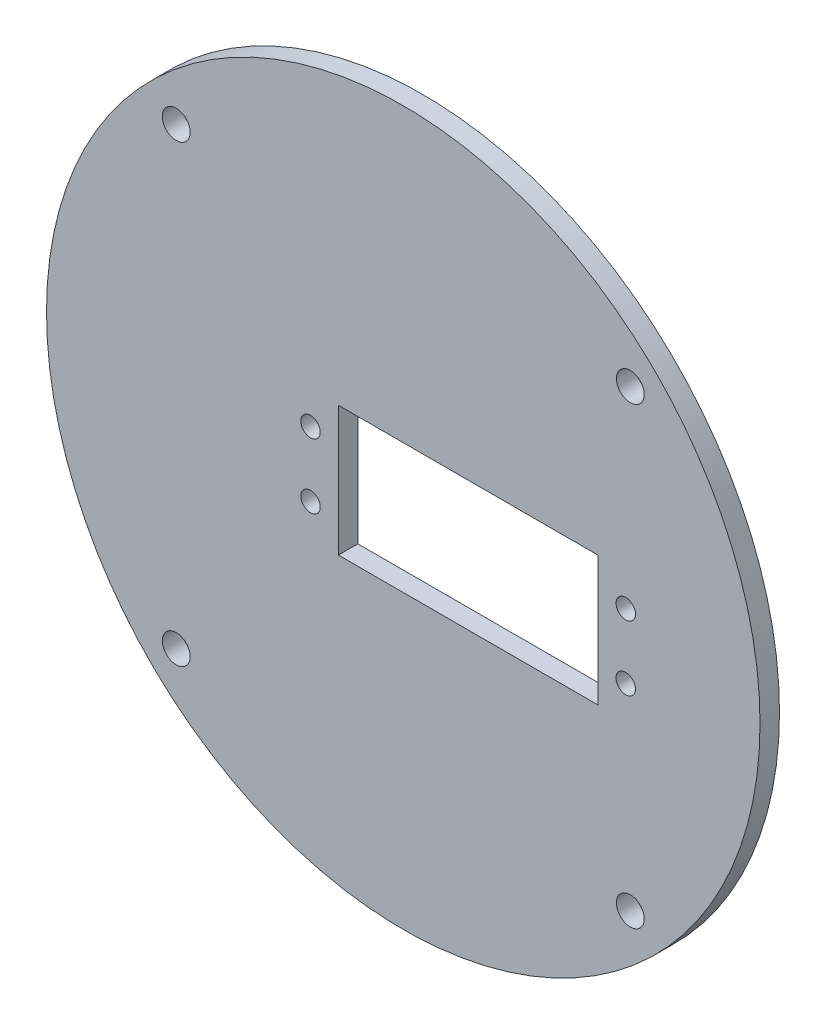
ISO-10303-21;
HEADER;
FILE_DESCRIPTION(('STEP AP214'),'2;1');
FILE_NAME('part.step','',(''),(''),'','','');
FILE_SCHEMA(('AUTOMOTIVE_DESIGN { 1 0 10303 214 1 1 1 1 }'));
ENDSEC;
DATA;
#1=APPLICATION_CONTEXT('core data for automotive mechanical design processes');
#2=APPLICATION_PROTOCOL_DEFINITION('international standard','automotive_design',2000,#1);
#3=PRODUCT_CONTEXT('',#1,'mechanical');
#4=PRODUCT('Part','Part','',(#3));
#5=PRODUCT_RELATED_PRODUCT_CATEGORY('part','',(#4));
#6=PRODUCT_DEFINITION_FORMATION('','',#4);
#7=PRODUCT_DEFINITION_CONTEXT('part definition',#1,'design');
#8=PRODUCT_DEFINITION('design','',#6,#7);
#9=PRODUCT_DEFINITION_SHAPE('','',#8);
#10=(LENGTH_UNIT() NAMED_UNIT(*) SI_UNIT(.MILLI.,.METRE.));
#11=(NAMED_UNIT(*) PLANE_ANGLE_UNIT() SI_UNIT($,.RADIAN.));
#12=(NAMED_UNIT(*) SI_UNIT($,.STERADIAN.) SOLID_ANGLE_UNIT());
#13=UNCERTAINTY_MEASURE_WITH_UNIT(LENGTH_MEASURE(1.E-05),#10,'distance_accuracy_value','');
#14=(GEOMETRIC_REPRESENTATION_CONTEXT(3) GLOBAL_UNCERTAINTY_ASSIGNED_CONTEXT((#13)) GLOBAL_UNIT_ASSIGNED_CONTEXT((#10,
#11,#12)) REPRESENTATION_CONTEXT('',''));
#15=CARTESIAN_POINT('',(0.,0.,0.));
#16=DIRECTION('',(0.,0.,1.));
#17=DIRECTION('',(1.,0.,0.));
#18=AXIS2_PLACEMENT_3D('',#15,#16,#17);
#19=CARTESIAN_POINT('',(0.,-10.,3.));
#20=DIRECTION('',(0.,1.,0.));
#21=DIRECTION('',(0.,0.,1.));
#22=AXIS2_PLACEMENT_3D('',#19,#20,#21);
#23=PLANE('',#22);
#24=DIRECTION('',(1.,0.,0.));
#25=VECTOR('',#24,1.);
#26=CARTESIAN_POINT('',(0.,-10.,0.));
#27=LINE('',#26,#25);
#28=CARTESIAN_POINT('',(-10.,-10.,0.));
#29=VERTEX_POINT('',#28);
#30=CARTESIAN_POINT('',(30.,-10.,0.));
#31=VERTEX_POINT('',#30);
#32=EDGE_CURVE('E157',#29,#31,#27,.T.);
#33=ORIENTED_EDGE('',*,*,#32,.F.);
#34=DIRECTION('',(0.,0.,-1.));
#35=VECTOR('',#34,1.);
#36=CARTESIAN_POINT('',(-10.,-10.,3.));
#37=LINE('',#36,#35);
#38=CARTESIAN_POINT('',(-10.,-10.,3.));
#39=VERTEX_POINT('',#38);
#40=EDGE_CURVE('E11',#39,#29,#37,.T.);
#41=ORIENTED_EDGE('',*,*,#40,.F.);
#42=DIRECTION('',(1.,0.,0.));
#43=VECTOR('',#42,1.);
#44=CARTESIAN_POINT('',(0.,-10.,3.));
#45=LINE('',#44,#43);
#46=CARTESIAN_POINT('',(30.,-10.,3.));
#47=VERTEX_POINT('',#46);
#48=EDGE_CURVE('E115',#39,#47,#45,.T.);
#49=ORIENTED_EDGE('',*,*,#48,.T.);
#50=DIRECTION('',(0.,0.,-1.));
#51=VECTOR('',#50,1.);
#52=CARTESIAN_POINT('',(30.,-10.,3.));
#53=LINE('',#52,#51);
#54=EDGE_CURVE('E88',#47,#31,#53,.T.);
#55=ORIENTED_EDGE('',*,*,#54,.T.);
#56=EDGE_LOOP('',(#33,#41,#49,#55));
#57=FACE_BOUND('',#56,.T.);
#58=ADVANCED_FACE('F50',(#57),#23,.T.);
#59=CARTESIAN_POINT('',(-10.,0.,3.));
#60=DIRECTION('',(1.,0.,0.));
#61=DIRECTION('',(0.,0.,-1.));
#62=AXIS2_PLACEMENT_3D('',#59,#60,#61);
#63=PLANE('',#62);
#64=DIRECTION('',(0.,-1.,0.));
#65=VECTOR('',#64,1.);
#66=CARTESIAN_POINT('',(-10.,0.,0.));
#67=LINE('',#66,#65);
#68=CARTESIAN_POINT('',(-10.,10.,0.));
#69=VERTEX_POINT('',#68);
#70=EDGE_CURVE('E99',#69,#29,#67,.T.);
#71=ORIENTED_EDGE('',*,*,#70,.F.);
#72=DIRECTION('',(0.,0.,-1.));
#73=VECTOR('',#72,1.);
#74=CARTESIAN_POINT('',(-10.,10.,3.));
#75=LINE('',#74,#73);
#76=CARTESIAN_POINT('',(-10.,10.,3.));
#77=VERTEX_POINT('',#76);
#78=EDGE_CURVE('E60',#77,#69,#75,.T.);
#79=ORIENTED_EDGE('',*,*,#78,.F.);
#80=DIRECTION('',(0.,-1.,0.));
#81=VECTOR('',#80,1.);
#82=CARTESIAN_POINT('',(-10.,0.,3.));
#83=LINE('',#82,#81);
#84=EDGE_CURVE('E96',#77,#39,#83,.T.);
#85=ORIENTED_EDGE('',*,*,#84,.T.);
#86=ORIENTED_EDGE('',*,*,#40,.T.);
#87=EDGE_LOOP('',(#71,#79,#85,#86));
#88=FACE_BOUND('',#87,.T.);
#89=ADVANCED_FACE('F98',(#88),#63,.T.);
#90=CARTESIAN_POINT('',(0.,10.,3.));
#91=DIRECTION('',(0.,1.,0.));
#92=DIRECTION('',(0.,0.,1.));
#93=AXIS2_PLACEMENT_3D('',#90,#91,#92);
#94=PLANE('',#93);
#95=DIRECTION('',(1.,0.,0.));
#96=VECTOR('',#95,1.);
#97=CARTESIAN_POINT('',(0.,10.,0.));
#98=LINE('',#97,#96);
#99=CARTESIAN_POINT('',(30.,10.,0.));
#100=VERTEX_POINT('',#99);
#101=EDGE_CURVE('E161',#69,#100,#98,.T.);
#102=ORIENTED_EDGE('',*,*,#101,.T.);
#103=DIRECTION('',(0.,0.,-1.));
#104=VECTOR('',#103,1.);
#105=CARTESIAN_POINT('',(30.,10.,3.));
#106=LINE('',#105,#104);
#107=CARTESIAN_POINT('',(30.,10.,3.));
#108=VERTEX_POINT('',#107);
#109=EDGE_CURVE('E104',#108,#100,#106,.T.);
#110=ORIENTED_EDGE('',*,*,#109,.F.);
#111=DIRECTION('',(1.,0.,0.));
#112=VECTOR('',#111,1.);
#113=CARTESIAN_POINT('',(0.,10.,3.));
#114=LINE('',#113,#112);
#115=EDGE_CURVE('E106',#77,#108,#114,.T.);
#116=ORIENTED_EDGE('',*,*,#115,.F.);
#117=ORIENTED_EDGE('',*,*,#78,.T.);
#118=EDGE_LOOP('',(#102,#110,#116,#117));
#119=FACE_BOUND('',#118,.T.);
#120=ADVANCED_FACE('F110',(#119),#94,.F.);
#121=CARTESIAN_POINT('',(35.0017856687341,-35.0017856687341,3.));
#122=DIRECTION('',(0.,0.,-1.));
#123=DIRECTION('',(-1.,0.,0.));
#124=AXIS2_PLACEMENT_3D('',#121,#122,#123);
#125=CYLINDRICAL_SURFACE('',#124,2.15);
#126=CARTESIAN_POINT('',(35.0017856687341,-35.0017856687341,3.));
#127=DIRECTION('',(0.,0.,1.));
#128=DIRECTION('',(1.,0.,0.));
#129=AXIS2_PLACEMENT_3D('',#126,#127,#128);
#130=CIRCLE('',#129,2.15);
#131=CARTESIAN_POINT('',(37.1517856687341,-35.0017856687341,3.));
#132=VERTEX_POINT('',#131);
#133=EDGE_CURVE('E145',#132,#132,#130,.T.);
#134=ORIENTED_EDGE('',*,*,#133,.T.);
#135=EDGE_LOOP('',(#134));
#136=FACE_BOUND('',#135,.T.);
#137=CARTESIAN_POINT('',(35.0017856687341,-35.0017856687341,0.));
#138=DIRECTION('',(0.,0.,1.));
#139=DIRECTION('',(1.,0.,0.));
#140=AXIS2_PLACEMENT_3D('',#137,#138,#139);
#141=CIRCLE('',#140,2.15);
#142=CARTESIAN_POINT('',(37.1517856687341,-35.0017856687341,0.));
#143=VERTEX_POINT('',#142);
#144=EDGE_CURVE('E189',#143,#143,#141,.T.);
#145=ORIENTED_EDGE('',*,*,#144,.F.);
#146=EDGE_LOOP('',(#145));
#147=FACE_BOUND('',#146,.T.);
#148=ADVANCED_FACE('F237',(#136,#147),#125,.F.);
#149=CARTESIAN_POINT('',(-35.0017856687341,-35.0017856687341,3.));
#150=DIRECTION('',(0.,0.,-1.));
#151=DIRECTION('',(-1.,0.,0.));
#152=AXIS2_PLACEMENT_3D('',#149,#150,#151);
#153=CYLINDRICAL_SURFACE('',#152,2.15);
#154=CARTESIAN_POINT('',(-35.0017856687341,-35.0017856687341,3.));
#155=DIRECTION('',(0.,0.,1.));
#156=DIRECTION('',(1.,0.,0.));
#157=AXIS2_PLACEMENT_3D('',#154,#155,#156);
#158=CIRCLE('',#157,2.15);
#159=CARTESIAN_POINT('',(-32.8517856687341,-35.0017856687341,3.));
#160=VERTEX_POINT('',#159);
#161=EDGE_CURVE('E137',#160,#160,#158,.T.);
#162=ORIENTED_EDGE('',*,*,#161,.T.);
#163=EDGE_LOOP('',(#162));
#164=FACE_BOUND('',#163,.T.);
#165=CARTESIAN_POINT('',(-35.0017856687341,-35.0017856687341,0.));
#166=DIRECTION('',(0.,0.,1.));
#167=DIRECTION('',(1.,0.,0.));
#168=AXIS2_PLACEMENT_3D('',#165,#166,#167);
#169=CIRCLE('',#168,2.15);
#170=CARTESIAN_POINT('',(-32.8517856687341,-35.0017856687341,0.));
#171=VERTEX_POINT('',#170);
#172=EDGE_CURVE('E183',#171,#171,#169,.T.);
#173=ORIENTED_EDGE('',*,*,#172,.F.);
#174=EDGE_LOOP('',(#173));
#175=FACE_BOUND('',#174,.T.);
#176=ADVANCED_FACE('F245',(#164,#175),#153,.F.);
#177=CARTESIAN_POINT('',(35.0017856687341,35.0017856687341,3.));
#178=DIRECTION('',(0.,0.,-1.));
#179=DIRECTION('',(-1.,0.,0.));
#180=AXIS2_PLACEMENT_3D('',#177,#178,#179);
#181=CYLINDRICAL_SURFACE('',#180,2.15);
#182=CARTESIAN_POINT('',(35.0017856687341,35.0017856687341,3.));
#183=DIRECTION('',(0.,0.,1.));
#184=DIRECTION('',(1.,0.,0.));
#185=AXIS2_PLACEMENT_3D('',#182,#183,#184);
#186=CIRCLE('',#185,2.15);
#187=CARTESIAN_POINT('',(37.1517856687341,35.0017856687341,3.));
#188=VERTEX_POINT('',#187);
#189=EDGE_CURVE('E134',#188,#188,#186,.T.);
#190=ORIENTED_EDGE('',*,*,#189,.T.);
#191=EDGE_LOOP('',(#190));
#192=FACE_BOUND('',#191,.T.);
#193=CARTESIAN_POINT('',(35.0017856687341,35.0017856687341,0.));
#194=DIRECTION('',(0.,0.,1.));
#195=DIRECTION('',(1.,0.,0.));
#196=AXIS2_PLACEMENT_3D('',#193,#194,#195);
#197=CIRCLE('',#196,2.15);
#198=CARTESIAN_POINT('',(37.1517856687341,35.0017856687341,0.));
#199=VERTEX_POINT('',#198);
#200=EDGE_CURVE('E179',#199,#199,#197,.T.);
#201=ORIENTED_EDGE('',*,*,#200,.F.);
#202=EDGE_LOOP('',(#201));
#203=FACE_BOUND('',#202,.T.);
#204=ADVANCED_FACE('F246',(#192,#203),#181,.F.);
#205=CARTESIAN_POINT('',(-35.0017856687341,35.0017856687341,3.));
#206=DIRECTION('',(0.,0.,-1.));
#207=DIRECTION('',(-1.,0.,0.));
#208=AXIS2_PLACEMENT_3D('',#205,#206,#207);
#209=CYLINDRICAL_SURFACE('',#208,2.15);
#210=CARTESIAN_POINT('',(-35.0017856687341,35.0017856687341,3.));
#211=DIRECTION('',(0.,0.,1.));
#212=DIRECTION('',(1.,0.,0.));
#213=AXIS2_PLACEMENT_3D('',#210,#211,#212);
#214=CIRCLE('',#213,2.15);
#215=CARTESIAN_POINT('',(-32.8517856687341,35.0017856687341,3.));
#216=VERTEX_POINT('',#215);
#217=EDGE_CURVE('E129',#216,#216,#214,.T.);
#218=ORIENTED_EDGE('',*,*,#217,.T.);
#219=EDGE_LOOP('',(#218));
#220=FACE_BOUND('',#219,.T.);
#221=CARTESIAN_POINT('',(-35.0017856687341,35.0017856687341,0.));
#222=DIRECTION('',(0.,0.,1.));
#223=DIRECTION('',(1.,0.,0.));
#224=AXIS2_PLACEMENT_3D('',#221,#222,#223);
#225=CIRCLE('',#224,2.15);
#226=CARTESIAN_POINT('',(-32.8517856687341,35.0017856687341,0.));
#227=VERTEX_POINT('',#226);
#228=EDGE_CURVE('E176',#227,#227,#225,.T.);
#229=ORIENTED_EDGE('',*,*,#228,.F.);
#230=EDGE_LOOP('',(#229));
#231=FACE_BOUND('',#230,.T.);
#232=ADVANCED_FACE('F249',(#220,#231),#209,.F.);
#233=CARTESIAN_POINT('',(-14.3,5.,3.));
#234=DIRECTION('',(0.,0.,-1.));
#235=DIRECTION('',(-1.,0.,0.));
#236=AXIS2_PLACEMENT_3D('',#233,#234,#235);
#237=CYLINDRICAL_SURFACE('',#236,1.5);
#238=CARTESIAN_POINT('',(-14.3,5.,3.));
#239=DIRECTION('',(0.,0.,1.));
#240=DIRECTION('',(1.,0.,0.));
#241=AXIS2_PLACEMENT_3D('',#238,#239,#240);
#242=CIRCLE('',#241,1.5);
#243=CARTESIAN_POINT('',(-12.8,5.,3.));
#244=VERTEX_POINT('',#243);
#245=EDGE_CURVE('E126',#244,#244,#242,.T.);
#246=ORIENTED_EDGE('',*,*,#245,.T.);
#247=EDGE_LOOP('',(#246));
#248=FACE_BOUND('',#247,.T.);
#249=CARTESIAN_POINT('',(-14.3,5.,0.));
#250=DIRECTION('',(0.,0.,1.));
#251=DIRECTION('',(1.,0.,0.));
#252=AXIS2_PLACEMENT_3D('',#249,#250,#251);
#253=CIRCLE('',#252,1.5);
#254=CARTESIAN_POINT('',(-12.8,5.,0.));
#255=VERTEX_POINT('',#254);
#256=EDGE_CURVE('E175',#255,#255,#253,.T.);
#257=ORIENTED_EDGE('',*,*,#256,.F.);
#258=EDGE_LOOP('',(#257));
#259=FACE_BOUND('',#258,.T.);
#260=ADVANCED_FACE('F251',(#248,#259),#237,.F.);
#261=CARTESIAN_POINT('',(-14.3,-5.,3.));
#262=DIRECTION('',(0.,0.,-1.));
#263=DIRECTION('',(-1.,0.,0.));
#264=AXIS2_PLACEMENT_3D('',#261,#262,#263);
#265=CYLINDRICAL_SURFACE('',#264,1.5);
#266=CARTESIAN_POINT('',(-14.3,-5.,3.));
#267=DIRECTION('',(0.,0.,1.));
#268=DIRECTION('',(1.,0.,0.));
#269=AXIS2_PLACEMENT_3D('',#266,#267,#268);
#270=CIRCLE('',#269,1.5);
#271=CARTESIAN_POINT('',(-12.8,-5.,3.));
#272=VERTEX_POINT('',#271);
#273=EDGE_CURVE('E125',#272,#272,#270,.T.);
#274=ORIENTED_EDGE('',*,*,#273,.T.);
#275=EDGE_LOOP('',(#274));
#276=FACE_BOUND('',#275,.T.);
#277=CARTESIAN_POINT('',(-14.3,-5.,0.));
#278=DIRECTION('',(0.,0.,1.));
#279=DIRECTION('',(1.,0.,0.));
#280=AXIS2_PLACEMENT_3D('',#277,#278,#279);
#281=CIRCLE('',#280,1.5);
#282=CARTESIAN_POINT('',(-12.8,-5.,0.));
#283=VERTEX_POINT('',#282);
#284=EDGE_CURVE('E166',#283,#283,#281,.T.);
#285=ORIENTED_EDGE('',*,*,#284,.F.);
#286=EDGE_LOOP('',(#285));
#287=FACE_BOUND('',#286,.T.);
#288=ADVANCED_FACE('F216',(#276,#287),#265,.F.);
#289=CARTESIAN_POINT('',(30.,0.,3.));
#290=DIRECTION('',(1.,0.,0.));
#291=DIRECTION('',(0.,0.,-1.));
#292=AXIS2_PLACEMENT_3D('',#289,#290,#291);
#293=PLANE('',#292);
#294=DIRECTION('',(0.,-1.,0.));
#295=VECTOR('',#294,1.);
#296=CARTESIAN_POINT('',(30.,0.,0.));
#297=LINE('',#296,#295);
#298=EDGE_CURVE('E81',#100,#31,#297,.T.);
#299=ORIENTED_EDGE('',*,*,#298,.T.);
#300=ORIENTED_EDGE('',*,*,#54,.F.);
#301=DIRECTION('',(0.,-1.,0.));
#302=VECTOR('',#301,1.);
#303=CARTESIAN_POINT('',(30.,0.,3.));
#304=LINE('',#303,#302);
#305=EDGE_CURVE('E64',#108,#47,#304,.T.);
#306=ORIENTED_EDGE('',*,*,#305,.F.);
#307=ORIENTED_EDGE('',*,*,#109,.T.);
#308=EDGE_LOOP('',(#299,#300,#306,#307));
#309=FACE_BOUND('',#308,.T.);
#310=ADVANCED_FACE('F201',(#309),#293,.F.);
#311=CARTESIAN_POINT('',(34.3,5.,3.));
#312=DIRECTION('',(0.,0.,-1.));
#313=DIRECTION('',(-1.,0.,0.));
#314=AXIS2_PLACEMENT_3D('',#311,#312,#313);
#315=CYLINDRICAL_SURFACE('',#314,1.5);
#316=CARTESIAN_POINT('',(34.3,5.,3.));
#317=DIRECTION('',(0.,0.,1.));
#318=DIRECTION('',(1.,0.,0.));
#319=AXIS2_PLACEMENT_3D('',#316,#317,#318);
#320=CIRCLE('',#319,1.5);
#321=CARTESIAN_POINT('',(35.8,5.,3.));
#322=VERTEX_POINT('',#321);
#323=EDGE_CURVE('E116',#322,#322,#320,.T.);
#324=ORIENTED_EDGE('',*,*,#323,.T.);
#325=EDGE_LOOP('',(#324));
#326=FACE_BOUND('',#325,.T.);
#327=CARTESIAN_POINT('',(34.3,5.,0.));
#328=DIRECTION('',(0.,0.,1.));
#329=DIRECTION('',(1.,0.,0.));
#330=AXIS2_PLACEMENT_3D('',#327,#328,#329);
#331=CIRCLE('',#330,1.5);
#332=CARTESIAN_POINT('',(35.8,5.,0.));
#333=VERTEX_POINT('',#332);
#334=EDGE_CURVE('E154',#333,#333,#331,.T.);
#335=ORIENTED_EDGE('',*,*,#334,.F.);
#336=EDGE_LOOP('',(#335));
#337=FACE_BOUND('',#336,.T.);
#338=ADVANCED_FACE('F211',(#326,#337),#315,.F.);
#339=CARTESIAN_POINT('',(34.3,-5.,3.));
#340=DIRECTION('',(0.,0.,-1.));
#341=DIRECTION('',(-1.,0.,0.));
#342=AXIS2_PLACEMENT_3D('',#339,#340,#341);
#343=CYLINDRICAL_SURFACE('',#342,1.5);
#344=CARTESIAN_POINT('',(34.3,-5.,3.));
#345=DIRECTION('',(0.,0.,1.));
#346=DIRECTION('',(1.,0.,0.));
#347=AXIS2_PLACEMENT_3D('',#344,#345,#346);
#348=CIRCLE('',#347,1.5);
#349=CARTESIAN_POINT('',(35.8,-5.,3.));
#350=VERTEX_POINT('',#349);
#351=EDGE_CURVE('E197',#350,#350,#348,.T.);
#352=ORIENTED_EDGE('',*,*,#351,.T.);
#353=EDGE_LOOP('',(#352));
#354=FACE_BOUND('',#353,.T.);
#355=CARTESIAN_POINT('',(34.3,-5.,0.));
#356=DIRECTION('',(0.,0.,1.));
#357=DIRECTION('',(1.,0.,0.));
#358=AXIS2_PLACEMENT_3D('',#355,#356,#357);
#359=CIRCLE('',#358,1.5);
#360=CARTESIAN_POINT('',(35.8,-5.,0.));
#361=VERTEX_POINT('',#360);
#362=EDGE_CURVE('E149',#361,#361,#359,.T.);
#363=ORIENTED_EDGE('',*,*,#362,.F.);
#364=EDGE_LOOP('',(#363));
#365=FACE_BOUND('',#364,.T.);
#366=ADVANCED_FACE('F47',(#354,#365),#343,.F.);
#367=CARTESIAN_POINT('',(0.,0.,3.));
#368=DIRECTION('',(0.,0.,-1.));
#369=DIRECTION('',(-1.,0.,0.));
#370=AXIS2_PLACEMENT_3D('',#367,#368,#369);
#371=CYLINDRICAL_SURFACE('',#370,55.);
#372=CARTESIAN_POINT('',(0.,0.,3.));
#373=DIRECTION('',(0.,0.,1.));
#374=DIRECTION('',(1.,0.,0.));
#375=AXIS2_PLACEMENT_3D('',#372,#373,#374);
#376=CIRCLE('',#375,55.);
#377=CARTESIAN_POINT('',(55.,0.,3.));
#378=VERTEX_POINT('',#377);
#379=EDGE_CURVE('E146',#378,#378,#376,.T.);
#380=ORIENTED_EDGE('',*,*,#379,.F.);
#381=EDGE_LOOP('',(#380));
#382=FACE_BOUND('',#381,.T.);
#383=CARTESIAN_POINT('',(0.,0.,0.));
#384=DIRECTION('',(0.,0.,1.));
#385=DIRECTION('',(1.,0.,0.));
#386=AXIS2_PLACEMENT_3D('',#383,#384,#385);
#387=CIRCLE('',#386,55.);
#388=CARTESIAN_POINT('',(55.,0.,0.));
#389=VERTEX_POINT('',#388);
#390=EDGE_CURVE('E195',#389,#389,#387,.T.);
#391=ORIENTED_EDGE('',*,*,#390,.T.);
#392=EDGE_LOOP('',(#391));
#393=FACE_BOUND('',#392,.T.);
#394=ADVANCED_FACE('F218',(#382,#393),#371,.T.);
#395=CARTESIAN_POINT('',(0.,0.,3.));
#396=DIRECTION('',(0.,0.,1.));
#397=DIRECTION('',(1.,0.,0.));
#398=AXIS2_PLACEMENT_3D('',#395,#396,#397);
#399=PLANE('',#398);
#400=ORIENTED_EDGE('',*,*,#351,.F.);
#401=EDGE_LOOP('',(#400));
#402=FACE_BOUND('',#401,.T.);
#403=ORIENTED_EDGE('',*,*,#323,.F.);
#404=EDGE_LOOP('',(#403));
#405=FACE_BOUND('',#404,.T.);
#406=ORIENTED_EDGE('',*,*,#48,.F.);
#407=ORIENTED_EDGE('',*,*,#84,.F.);
#408=ORIENTED_EDGE('',*,*,#115,.T.);
#409=ORIENTED_EDGE('',*,*,#305,.T.);
#410=EDGE_LOOP('',(#406,#407,#408,#409));
#411=FACE_BOUND('',#410,.T.);
#412=ORIENTED_EDGE('',*,*,#273,.F.);
#413=EDGE_LOOP('',(#412));
#414=FACE_BOUND('',#413,.T.);
#415=ORIENTED_EDGE('',*,*,#245,.F.);
#416=EDGE_LOOP('',(#415));
#417=FACE_BOUND('',#416,.T.);
#418=ORIENTED_EDGE('',*,*,#217,.F.);
#419=EDGE_LOOP('',(#418));
#420=FACE_BOUND('',#419,.T.);
#421=ORIENTED_EDGE('',*,*,#189,.F.);
#422=EDGE_LOOP('',(#421));
#423=FACE_BOUND('',#422,.T.);
#424=ORIENTED_EDGE('',*,*,#161,.F.);
#425=EDGE_LOOP('',(#424));
#426=FACE_BOUND('',#425,.T.);
#427=ORIENTED_EDGE('',*,*,#133,.F.);
#428=EDGE_LOOP('',(#427));
#429=FACE_BOUND('',#428,.T.);
#430=ORIENTED_EDGE('',*,*,#379,.T.);
#431=EDGE_LOOP('',(#430));
#432=FACE_BOUND('',#431,.T.);
#433=ADVANCED_FACE('F109',(#402,#405,#411,#414,#417,#420,#423,#426,#429,#432),#399,.T.);
#434=CARTESIAN_POINT('',(0.,0.,0.));
#435=DIRECTION('',(0.,0.,1.));
#436=DIRECTION('',(1.,0.,0.));
#437=AXIS2_PLACEMENT_3D('',#434,#435,#436);
#438=PLANE('',#437);
#439=ORIENTED_EDGE('',*,*,#362,.T.);
#440=EDGE_LOOP('',(#439));
#441=FACE_BOUND('',#440,.T.);
#442=ORIENTED_EDGE('',*,*,#334,.T.);
#443=EDGE_LOOP('',(#442));
#444=FACE_BOUND('',#443,.T.);
#445=ORIENTED_EDGE('',*,*,#32,.T.);
#446=ORIENTED_EDGE('',*,*,#298,.F.);
#447=ORIENTED_EDGE('',*,*,#101,.F.);
#448=ORIENTED_EDGE('',*,*,#70,.T.);
#449=EDGE_LOOP('',(#445,#446,#447,#448));
#450=FACE_BOUND('',#449,.T.);
#451=ORIENTED_EDGE('',*,*,#284,.T.);
#452=EDGE_LOOP('',(#451));
#453=FACE_BOUND('',#452,.T.);
#454=ORIENTED_EDGE('',*,*,#256,.T.);
#455=EDGE_LOOP('',(#454));
#456=FACE_BOUND('',#455,.T.);
#457=ORIENTED_EDGE('',*,*,#228,.T.);
#458=EDGE_LOOP('',(#457));
#459=FACE_BOUND('',#458,.T.);
#460=ORIENTED_EDGE('',*,*,#200,.T.);
#461=EDGE_LOOP('',(#460));
#462=FACE_BOUND('',#461,.T.);
#463=ORIENTED_EDGE('',*,*,#172,.T.);
#464=EDGE_LOOP('',(#463));
#465=FACE_BOUND('',#464,.T.);
#466=ORIENTED_EDGE('',*,*,#144,.T.);
#467=EDGE_LOOP('',(#466));
#468=FACE_BOUND('',#467,.T.);
#469=ORIENTED_EDGE('',*,*,#390,.F.);
#470=EDGE_LOOP('',(#469));
#471=FACE_BOUND('',#470,.T.);
#472=ADVANCED_FACE('F205',(#441,#444,#450,#453,#456,#459,#462,#465,#468,#471),#438,.F.);
#473=CLOSED_SHELL('',(#58,#89,#120,#148,#176,#204,#232,#260,#288,#310,#338,#366,#394,#433,#472));
#474=MANIFOLD_SOLID_BREP('B2',#473);
#475=ADVANCED_BREP_SHAPE_REPRESENTATION('',(#18,#474),#14);
#476=SHAPE_DEFINITION_REPRESENTATION(#9,#475);
ENDSEC;
END-ISO-10303-21;
